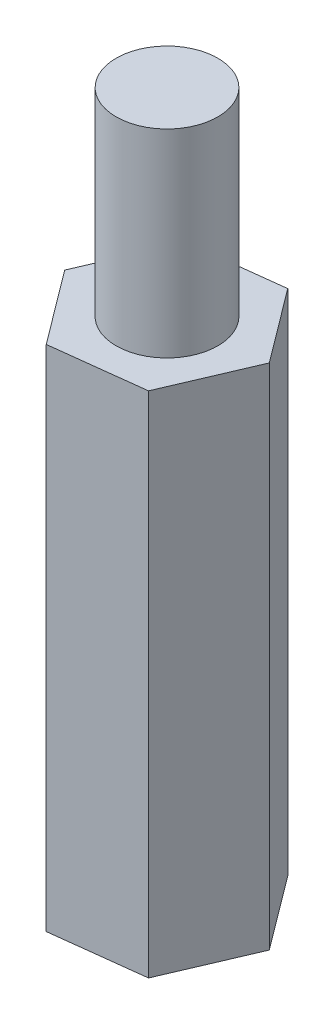
ISO-10303-21;
HEADER;
FILE_DESCRIPTION(('STEP AP214'),'2;1');
FILE_NAME('part.step','',(''),(''),'','','');
FILE_SCHEMA(('AUTOMOTIVE_DESIGN { 1 0 10303 214 1 1 1 1 }'));
ENDSEC;
DATA;
#1=APPLICATION_CONTEXT('core data for automotive mechanical design processes');
#2=APPLICATION_PROTOCOL_DEFINITION('international standard','automotive_design',2000,#1);
#3=PRODUCT_CONTEXT('',#1,'mechanical');
#4=PRODUCT('Part','Part','',(#3));
#5=PRODUCT_RELATED_PRODUCT_CATEGORY('part','',(#4));
#6=PRODUCT_DEFINITION_FORMATION('','',#4);
#7=PRODUCT_DEFINITION_CONTEXT('part definition',#1,'design');
#8=PRODUCT_DEFINITION('design','',#6,#7);
#9=PRODUCT_DEFINITION_SHAPE('','',#8);
#10=(LENGTH_UNIT() NAMED_UNIT(*) SI_UNIT(.MILLI.,.METRE.));
#11=(NAMED_UNIT(*) PLANE_ANGLE_UNIT() SI_UNIT($,.RADIAN.));
#12=(NAMED_UNIT(*) SI_UNIT($,.STERADIAN.) SOLID_ANGLE_UNIT());
#13=UNCERTAINTY_MEASURE_WITH_UNIT(LENGTH_MEASURE(1.E-05),#10,'distance_accuracy_value','');
#14=(GEOMETRIC_REPRESENTATION_CONTEXT(3) GLOBAL_UNCERTAINTY_ASSIGNED_CONTEXT((#13)) GLOBAL_UNIT_ASSIGNED_CONTEXT((#10,
#11,#12)) REPRESENTATION_CONTEXT('',''));
#15=CARTESIAN_POINT('',(0.,0.,0.));
#16=DIRECTION('',(0.,0.,1.));
#17=DIRECTION('',(1.,0.,0.));
#18=AXIS2_PLACEMENT_3D('',#15,#16,#17);
#19=CARTESIAN_POINT('',(0.,20.85,0.));
#20=DIRECTION('',(0.,-1.,0.));
#21=DIRECTION('',(0.,0.,-1.));
#22=AXIS2_PLACEMENT_3D('',#19,#20,#21);
#23=CYLINDRICAL_SURFACE('',#22,1.5);
#24=CARTESIAN_POINT('',(0.,20.85,0.));
#25=DIRECTION('',(0.,1.,0.));
#26=DIRECTION('',(0.,0.,1.));
#27=AXIS2_PLACEMENT_3D('',#24,#25,#26);
#28=CIRCLE('',#27,1.5);
#29=CARTESIAN_POINT('',(0.,20.85,1.5));
#30=VERTEX_POINT('',#29);
#31=EDGE_CURVE('E11',#30,#30,#28,.T.);
#32=ORIENTED_EDGE('',*,*,#31,.F.);
#33=EDGE_LOOP('',(#32));
#34=FACE_BOUND('',#33,.T.);
#35=CARTESIAN_POINT('',(0.,15.,0.));
#36=DIRECTION('',(0.,1.,0.));
#37=DIRECTION('',(0.,0.,1.));
#38=AXIS2_PLACEMENT_3D('',#35,#36,#37);
#39=CIRCLE('',#38,1.5);
#40=CARTESIAN_POINT('',(0.,15.,1.5));
#41=VERTEX_POINT('',#40);
#42=EDGE_CURVE('E44',#41,#41,#39,.T.);
#43=ORIENTED_EDGE('',*,*,#42,.T.);
#44=EDGE_LOOP('',(#43));
#45=FACE_BOUND('',#44,.T.);
#46=ADVANCED_FACE('F41',(#34,#45),#23,.T.);
#47=CARTESIAN_POINT('',(0.,20.85,0.));
#48=DIRECTION('',(0.,1.,0.));
#49=DIRECTION('',(0.,0.,1.));
#50=AXIS2_PLACEMENT_3D('',#47,#48,#49);
#51=PLANE('',#50);
#52=ORIENTED_EDGE('',*,*,#31,.T.);
#53=EDGE_LOOP('',(#52));
#54=FACE_BOUND('',#53,.T.);
#55=ADVANCED_FACE('F56',(#54),#51,.T.);
#56=CARTESIAN_POINT('',(0.,15.,0.));
#57=DIRECTION('',(0.,1.,0.));
#58=DIRECTION('',(0.,0.,1.));
#59=AXIS2_PLACEMENT_3D('',#56,#57,#58);
#60=PLANE('',#59);
#61=ORIENTED_EDGE('',*,*,#42,.F.);
#62=EDGE_LOOP('',(#61));
#63=FACE_BOUND('',#62,.T.);
#64=ADVANCED_FACE('F54',(#63),#60,.F.);
#65=CLOSED_SHELL('',(#46,#55,#64));
#66=MANIFOLD_SOLID_BREP('B2',#65);
#67=CARTESIAN_POINT('',(0.,15.,0.));
#68=DIRECTION('',(0.,1.,0.));
#69=DIRECTION('',(0.,0.,1.));
#70=AXIS2_PLACEMENT_3D('',#67,#68,#69);
#71=PLANE('',#70);
#72=DIRECTION('',(-0.393444456417022,0.,0.919348388650741));
#73=VECTOR('',#72,1.);
#74=CARTESIAN_POINT('',(-1.62665384569394,15.,-2.17194166579641));
#75=LINE('',#74,#73);
#76=CARTESIAN_POINT('',(-1.62665384569394,15.,-2.17194166579641));
#77=VERTEX_POINT('',#76);
#78=CARTESIAN_POINT('',(-2.69428358096455,15.,0.3227527206364));
#79=VERTEX_POINT('',#78);
#80=EDGE_CURVE('E178',#77,#79,#75,.T.);
#81=ORIENTED_EDGE('',*,*,#80,.T.);
#82=DIRECTION('',(0.59945683129132,0.,0.800407088560671));
#83=VECTOR('',#82,1.);
#84=CARTESIAN_POINT('',(-2.69428358096455,15.,0.3227527206364));
#85=LINE('',#84,#83);
#86=CARTESIAN_POINT('',(-1.06762973527061,15.,2.4946943864328));
#87=VERTEX_POINT('',#86);
#88=EDGE_CURVE('E136',#79,#87,#85,.T.);
#89=ORIENTED_EDGE('',*,*,#88,.T.);
#90=DIRECTION('',(0.992901287708342,0.,-0.118941300090069));
#91=VECTOR('',#90,1.);
#92=CARTESIAN_POINT('',(-1.06762973527061,15.,2.4946943864328));
#93=LINE('',#92,#91);
#94=CARTESIAN_POINT('',(1.62665384569394,15.,2.17194166579641));
#95=VERTEX_POINT('',#94);
#96=EDGE_CURVE('E149',#87,#95,#93,.T.);
#97=ORIENTED_EDGE('',*,*,#96,.T.);
#98=DIRECTION('',(0.393444456417023,0.,-0.919348388650741));
#99=VECTOR('',#98,1.);
#100=CARTESIAN_POINT('',(1.62665384569394,15.,2.17194166579641));
#101=LINE('',#100,#99);
#102=CARTESIAN_POINT('',(2.69428358096455,15.,-0.322752720636398));
#103=VERTEX_POINT('',#102);
#104=EDGE_CURVE('E143',#95,#103,#101,.T.);
#105=ORIENTED_EDGE('',*,*,#104,.T.);
#106=DIRECTION('',(-0.599456831291319,0.,-0.800407088560672));
#107=VECTOR('',#106,1.);
#108=CARTESIAN_POINT('',(2.69428358096455,15.,-0.322752720636398));
#109=LINE('',#108,#107);
#110=CARTESIAN_POINT('',(1.06762973527061,15.,-2.4946943864328));
#111=VERTEX_POINT('',#110);
#112=EDGE_CURVE('E147',#103,#111,#109,.T.);
#113=ORIENTED_EDGE('',*,*,#112,.T.);
#114=DIRECTION('',(-0.992901287708342,0.,0.118941300090069));
#115=VECTOR('',#114,1.);
#116=CARTESIAN_POINT('',(1.06762973527061,15.,-2.4946943864328));
#117=LINE('',#116,#115);
#118=EDGE_CURVE('E99',#111,#77,#117,.T.);
#119=ORIENTED_EDGE('',*,*,#118,.T.);
#120=EDGE_LOOP('',(#81,#89,#97,#105,#113,#119));
#121=FACE_BOUND('',#120,.T.);
#122=CARTESIAN_POINT('',(0.,15.,0.));
#123=DIRECTION('',(0.,1.,0.));
#124=DIRECTION('',(0.,0.,1.));
#125=AXIS2_PLACEMENT_3D('',#122,#123,#124);
#126=CIRCLE('',#125,1.5);
#127=CARTESIAN_POINT('',(0.,15.,1.5));
#128=VERTEX_POINT('',#127);
#129=EDGE_CURVE('E171',#128,#128,#126,.T.);
#130=ORIENTED_EDGE('',*,*,#129,.F.);
#131=EDGE_LOOP('',(#130));
#132=FACE_BOUND('',#131,.T.);
#133=ADVANCED_FACE('F82',(#121,#132),#71,.T.);
#134=CARTESIAN_POINT('',(0.,0.,0.));
#135=DIRECTION('',(0.,1.,0.));
#136=DIRECTION('',(0.,0.,1.));
#137=AXIS2_PLACEMENT_3D('',#134,#135,#136);
#138=PLANE('',#137);
#139=DIRECTION('',(-0.393444456417022,0.,0.919348388650741));
#140=VECTOR('',#139,1.);
#141=CARTESIAN_POINT('',(-1.62665384569394,0.,-2.17194166579641));
#142=LINE('',#141,#140);
#143=CARTESIAN_POINT('',(-1.62665384569394,0.,-2.17194166579641));
#144=VERTEX_POINT('',#143);
#145=CARTESIAN_POINT('',(-2.69428358096455,0.,0.3227527206364));
#146=VERTEX_POINT('',#145);
#147=EDGE_CURVE('E167',#144,#146,#142,.T.);
#148=ORIENTED_EDGE('',*,*,#147,.F.);
#149=DIRECTION('',(-0.992901287708342,0.,0.118941300090069));
#150=VECTOR('',#149,1.);
#151=CARTESIAN_POINT('',(1.06762973527061,0.,-2.4946943864328));
#152=LINE('',#151,#150);
#153=CARTESIAN_POINT('',(1.06762973527061,0.,-2.4946943864328));
#154=VERTEX_POINT('',#153);
#155=EDGE_CURVE('E128',#154,#144,#152,.T.);
#156=ORIENTED_EDGE('',*,*,#155,.F.);
#157=DIRECTION('',(-0.599456831291319,0.,-0.800407088560672));
#158=VECTOR('',#157,1.);
#159=CARTESIAN_POINT('',(2.69428358096455,0.,-0.322752720636398));
#160=LINE('',#159,#158);
#161=CARTESIAN_POINT('',(2.69428358096455,0.,-0.322752720636398));
#162=VERTEX_POINT('',#161);
#163=EDGE_CURVE('E122',#162,#154,#160,.T.);
#164=ORIENTED_EDGE('',*,*,#163,.F.);
#165=DIRECTION('',(0.393444456417023,0.,-0.919348388650741));
#166=VECTOR('',#165,1.);
#167=CARTESIAN_POINT('',(1.62665384569394,0.,2.17194166579641));
#168=LINE('',#167,#166);
#169=CARTESIAN_POINT('',(1.62665384569394,0.,2.17194166579641));
#170=VERTEX_POINT('',#169);
#171=EDGE_CURVE('E157',#170,#162,#168,.T.);
#172=ORIENTED_EDGE('',*,*,#171,.F.);
#173=DIRECTION('',(0.992901287708342,0.,-0.118941300090069));
#174=VECTOR('',#173,1.);
#175=CARTESIAN_POINT('',(-1.06762973527061,0.,2.4946943864328));
#176=LINE('',#175,#174);
#177=CARTESIAN_POINT('',(-1.06762973527061,0.,2.4946943864328));
#178=VERTEX_POINT('',#177);
#179=EDGE_CURVE('E173',#178,#170,#176,.T.);
#180=ORIENTED_EDGE('',*,*,#179,.F.);
#181=DIRECTION('',(0.59945683129132,0.,0.800407088560671));
#182=VECTOR('',#181,1.);
#183=CARTESIAN_POINT('',(-2.69428358096455,0.,0.3227527206364));
#184=LINE('',#183,#182);
#185=EDGE_CURVE('E170',#146,#178,#184,.T.);
#186=ORIENTED_EDGE('',*,*,#185,.F.);
#187=EDGE_LOOP('',(#148,#156,#164,#172,#180,#186));
#188=FACE_BOUND('',#187,.T.);
#189=CARTESIAN_POINT('',(0.,0.,0.));
#190=DIRECTION('',(0.,1.,0.));
#191=DIRECTION('',(0.,0.,1.));
#192=AXIS2_PLACEMENT_3D('',#189,#190,#191);
#193=CIRCLE('',#192,1.5);
#194=CARTESIAN_POINT('',(0.,0.,1.5));
#195=VERTEX_POINT('',#194);
#196=EDGE_CURVE('E271',#195,#195,#193,.T.);
#197=ORIENTED_EDGE('',*,*,#196,.T.);
#198=EDGE_LOOP('',(#197));
#199=FACE_BOUND('',#198,.T.);
#200=ADVANCED_FACE('F187',(#188,#199),#138,.F.);
#201=CARTESIAN_POINT('',(-1.62665384569394,15.,-2.17194166579641));
#202=DIRECTION('',(0.919348388650741,0.,0.393444456417022));
#203=DIRECTION('',(0.393444456417022,0.,-0.919348388650741));
#204=AXIS2_PLACEMENT_3D('',#201,#202,#203);
#205=PLANE('',#204);
#206=ORIENTED_EDGE('',*,*,#147,.T.);
#207=DIRECTION('',(0.,-1.,0.));
#208=VECTOR('',#207,1.);
#209=CARTESIAN_POINT('',(-2.69428358096455,15.,0.3227527206364));
#210=LINE('',#209,#208);
#211=EDGE_CURVE('E39',#79,#146,#210,.T.);
#212=ORIENTED_EDGE('',*,*,#211,.F.);
#213=ORIENTED_EDGE('',*,*,#80,.F.);
#214=DIRECTION('',(0.,-1.,0.));
#215=VECTOR('',#214,1.);
#216=CARTESIAN_POINT('',(-1.62665384569394,15.,-2.17194166579641));
#217=LINE('',#216,#215);
#218=EDGE_CURVE('E163',#77,#144,#217,.T.);
#219=ORIENTED_EDGE('',*,*,#218,.T.);
#220=EDGE_LOOP('',(#206,#212,#213,#219));
#221=FACE_BOUND('',#220,.T.);
#222=ADVANCED_FACE('F84',(#221),#205,.F.);
#223=CARTESIAN_POINT('',(-2.69428358096455,15.,0.3227527206364));
#224=DIRECTION('',(0.800407088560671,0.,-0.59945683129132));
#225=DIRECTION('',(-0.59945683129132,0.,-0.800407088560671));
#226=AXIS2_PLACEMENT_3D('',#223,#224,#225);
#227=PLANE('',#226);
#228=ORIENTED_EDGE('',*,*,#185,.T.);
#229=DIRECTION('',(0.,-1.,0.));
#230=VECTOR('',#229,1.);
#231=CARTESIAN_POINT('',(-1.06762973527061,15.,2.4946943864328));
#232=LINE('',#231,#230);
#233=EDGE_CURVE('E91',#87,#178,#232,.T.);
#234=ORIENTED_EDGE('',*,*,#233,.F.);
#235=ORIENTED_EDGE('',*,*,#88,.F.);
#236=ORIENTED_EDGE('',*,*,#211,.T.);
#237=EDGE_LOOP('',(#228,#234,#235,#236));
#238=FACE_BOUND('',#237,.T.);
#239=ADVANCED_FACE('F212',(#238),#227,.F.);
#240=CARTESIAN_POINT('',(-1.06762973527061,15.,2.4946943864328));
#241=DIRECTION('',(-0.118941300090069,0.,-0.992901287708342));
#242=DIRECTION('',(-0.992901287708342,0.,0.118941300090069));
#243=AXIS2_PLACEMENT_3D('',#240,#241,#242);
#244=PLANE('',#243);
#245=ORIENTED_EDGE('',*,*,#179,.T.);
#246=DIRECTION('',(0.,-1.,0.));
#247=VECTOR('',#246,1.);
#248=CARTESIAN_POINT('',(1.62665384569394,15.,2.17194166579641));
#249=LINE('',#248,#247);
#250=EDGE_CURVE('E158',#95,#170,#249,.T.);
#251=ORIENTED_EDGE('',*,*,#250,.F.);
#252=ORIENTED_EDGE('',*,*,#96,.F.);
#253=ORIENTED_EDGE('',*,*,#233,.T.);
#254=EDGE_LOOP('',(#245,#251,#252,#253));
#255=FACE_BOUND('',#254,.T.);
#256=ADVANCED_FACE('F184',(#255),#244,.F.);
#257=CARTESIAN_POINT('',(1.62665384569394,15.,2.17194166579641));
#258=DIRECTION('',(-0.919348388650741,0.,-0.393444456417023));
#259=DIRECTION('',(-0.393444456417023,0.,0.919348388650741));
#260=AXIS2_PLACEMENT_3D('',#257,#258,#259);
#261=PLANE('',#260);
#262=ORIENTED_EDGE('',*,*,#171,.T.);
#263=DIRECTION('',(0.,-1.,0.));
#264=VECTOR('',#263,1.);
#265=CARTESIAN_POINT('',(2.69428358096455,15.,-0.322752720636398));
#266=LINE('',#265,#264);
#267=EDGE_CURVE('E154',#103,#162,#266,.T.);
#268=ORIENTED_EDGE('',*,*,#267,.F.);
#269=ORIENTED_EDGE('',*,*,#104,.F.);
#270=ORIENTED_EDGE('',*,*,#250,.T.);
#271=EDGE_LOOP('',(#262,#268,#269,#270));
#272=FACE_BOUND('',#271,.T.);
#273=ADVANCED_FACE('F155',(#272),#261,.F.);
#274=CARTESIAN_POINT('',(2.69428358096455,15.,-0.322752720636398));
#275=DIRECTION('',(-0.800407088560672,0.,0.599456831291319));
#276=DIRECTION('',(0.599456831291319,0.,0.800407088560672));
#277=AXIS2_PLACEMENT_3D('',#274,#275,#276);
#278=PLANE('',#277);
#279=ORIENTED_EDGE('',*,*,#163,.T.);
#280=DIRECTION('',(0.,-1.,0.));
#281=VECTOR('',#280,1.);
#282=CARTESIAN_POINT('',(1.06762973527061,15.,-2.4946943864328));
#283=LINE('',#282,#281);
#284=EDGE_CURVE('E159',#111,#154,#283,.T.);
#285=ORIENTED_EDGE('',*,*,#284,.F.);
#286=ORIENTED_EDGE('',*,*,#112,.F.);
#287=ORIENTED_EDGE('',*,*,#267,.T.);
#288=EDGE_LOOP('',(#279,#285,#286,#287));
#289=FACE_BOUND('',#288,.T.);
#290=ADVANCED_FACE('F161',(#289),#278,.F.);
#291=CARTESIAN_POINT('',(1.06762973527061,15.,-2.4946943864328));
#292=DIRECTION('',(0.118941300090069,0.,0.992901287708342));
#293=DIRECTION('',(0.992901287708342,0.,-0.118941300090069));
#294=AXIS2_PLACEMENT_3D('',#291,#292,#293);
#295=PLANE('',#294);
#296=ORIENTED_EDGE('',*,*,#155,.T.);
#297=ORIENTED_EDGE('',*,*,#218,.F.);
#298=ORIENTED_EDGE('',*,*,#118,.F.);
#299=ORIENTED_EDGE('',*,*,#284,.T.);
#300=EDGE_LOOP('',(#296,#297,#298,#299));
#301=FACE_BOUND('',#300,.T.);
#302=ADVANCED_FACE('F192',(#301),#295,.F.);
#303=CARTESIAN_POINT('',(0.,15.,0.));
#304=DIRECTION('',(0.,-1.,0.));
#305=DIRECTION('',(0.,0.,-1.));
#306=AXIS2_PLACEMENT_3D('',#303,#304,#305);
#307=CYLINDRICAL_SURFACE('',#306,1.5);
#308=ORIENTED_EDGE('',*,*,#129,.T.);
#309=EDGE_LOOP('',(#308));
#310=FACE_BOUND('',#309,.T.);
#311=ORIENTED_EDGE('',*,*,#196,.F.);
#312=EDGE_LOOP('',(#311));
#313=FACE_BOUND('',#312,.T.);
#314=ADVANCED_FACE('F194',(#310,#313),#307,.F.);
#315=CLOSED_SHELL('',(#133,#200,#222,#239,#256,#273,#290,#302,#314));
#316=MANIFOLD_SOLID_BREP('B6',#315);
#317=ADVANCED_BREP_SHAPE_REPRESENTATION('',(#18,#66,#316),#14);
#318=SHAPE_DEFINITION_REPRESENTATION(#9,#317);
ENDSEC;
END-ISO-10303-21;
